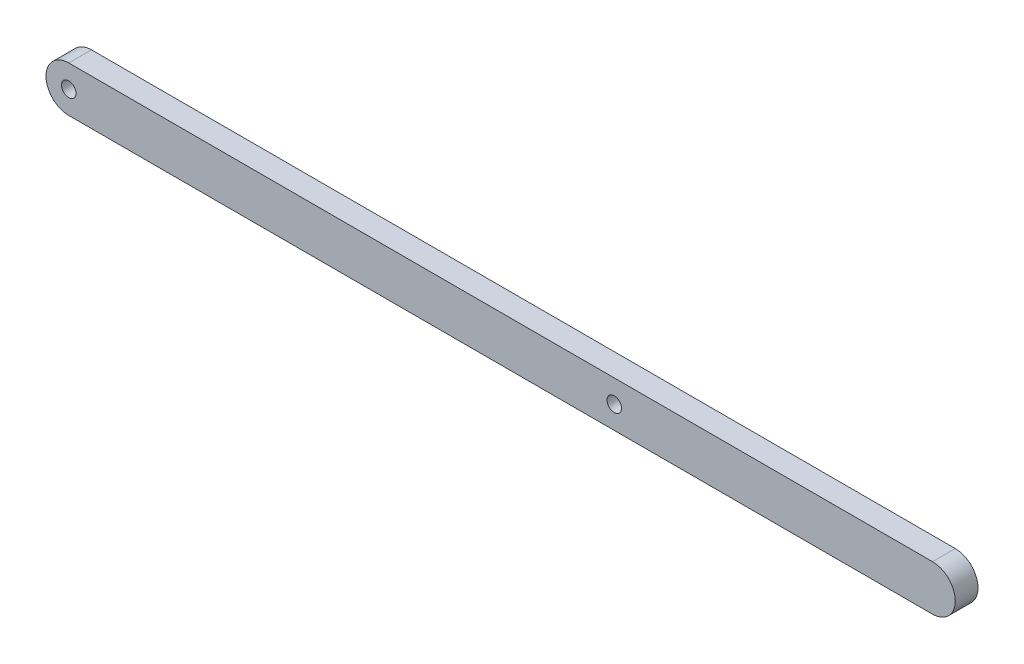
ISO-10303-21;
HEADER;
FILE_DESCRIPTION(('STEP AP214'),'2;1');
FILE_NAME('part.step','',(''),(''),'','','');
FILE_SCHEMA(('AUTOMOTIVE_DESIGN { 1 0 10303 214 1 1 1 1 }'));
ENDSEC;
DATA;
#1=APPLICATION_CONTEXT('core data for automotive mechanical design processes');
#2=APPLICATION_PROTOCOL_DEFINITION('international standard','automotive_design',2000,#1);
#3=PRODUCT_CONTEXT('',#1,'mechanical');
#4=PRODUCT('Part','Part','',(#3));
#5=PRODUCT_RELATED_PRODUCT_CATEGORY('part','',(#4));
#6=PRODUCT_DEFINITION_FORMATION('','',#4);
#7=PRODUCT_DEFINITION_CONTEXT('part definition',#1,'design');
#8=PRODUCT_DEFINITION('design','',#6,#7);
#9=PRODUCT_DEFINITION_SHAPE('','',#8);
#10=(LENGTH_UNIT() NAMED_UNIT(*) SI_UNIT(.MILLI.,.METRE.));
#11=(NAMED_UNIT(*) PLANE_ANGLE_UNIT() SI_UNIT($,.RADIAN.));
#12=(NAMED_UNIT(*) SI_UNIT($,.STERADIAN.) SOLID_ANGLE_UNIT());
#13=UNCERTAINTY_MEASURE_WITH_UNIT(LENGTH_MEASURE(1.E-05),#10,'distance_accuracy_value','');
#14=(GEOMETRIC_REPRESENTATION_CONTEXT(3) GLOBAL_UNCERTAINTY_ASSIGNED_CONTEXT((#13)) GLOBAL_UNIT_ASSIGNED_CONTEXT((#10,
#11,#12)) REPRESENTATION_CONTEXT('',''));
#15=CARTESIAN_POINT('',(0.,0.,0.));
#16=DIRECTION('',(0.,0.,1.));
#17=DIRECTION('',(1.,0.,0.));
#18=AXIS2_PLACEMENT_3D('',#15,#16,#17);
#19=CARTESIAN_POINT('',(0.,0.,5.));
#20=DIRECTION('',(0.,0.,1.));
#21=DIRECTION('',(1.,0.,0.));
#22=AXIS2_PLACEMENT_3D('',#19,#20,#21);
#23=PLANE('',#22);
#24=CARTESIAN_POINT('',(120.,0.,5.));
#25=DIRECTION('',(0.,0.,1.));
#26=DIRECTION('',(1.,0.,0.));
#27=AXIS2_PLACEMENT_3D('',#24,#25,#26);
#28=CIRCLE('',#27,1.60000000000001);
#29=CARTESIAN_POINT('',(121.6,0.,5.));
#30=VERTEX_POINT('',#29);
#31=EDGE_CURVE('E112',#30,#30,#28,.T.);
#32=ORIENTED_EDGE('',*,*,#31,.F.);
#33=EDGE_LOOP('',(#32));
#34=FACE_BOUND('',#33,.T.);
#35=CARTESIAN_POINT('',(0.,0.,5.));
#36=DIRECTION('',(0.,0.,1.));
#37=DIRECTION('',(1.,0.,0.));
#38=AXIS2_PLACEMENT_3D('',#35,#36,#37);
#39=CIRCLE('',#38,5.);
#40=CARTESIAN_POINT('',(0.,5.,5.));
#41=VERTEX_POINT('',#40);
#42=CARTESIAN_POINT('',(0.,-5.,5.));
#43=VERTEX_POINT('',#42);
#44=EDGE_CURVE('E92',#41,#43,#39,.T.);
#45=ORIENTED_EDGE('',*,*,#44,.T.);
#46=DIRECTION('',(1.,0.,0.));
#47=VECTOR('',#46,1.);
#48=CARTESIAN_POINT('',(0.,-5.,5.));
#49=LINE('',#48,#47);
#50=CARTESIAN_POINT('',(190.,-5.,5.));
#51=VERTEX_POINT('',#50);
#52=EDGE_CURVE('E87',#43,#51,#49,.T.);
#53=ORIENTED_EDGE('',*,*,#52,.T.);
#54=CARTESIAN_POINT('',(190.,0.,5.));
#55=DIRECTION('',(0.,0.,1.));
#56=DIRECTION('',(1.,0.,0.));
#57=AXIS2_PLACEMENT_3D('',#54,#55,#56);
#58=CIRCLE('',#57,5.);
#59=CARTESIAN_POINT('',(190.,5.,5.));
#60=VERTEX_POINT('',#59);
#61=EDGE_CURVE('E90',#51,#60,#58,.T.);
#62=ORIENTED_EDGE('',*,*,#61,.T.);
#63=DIRECTION('',(-1.,0.,0.));
#64=VECTOR('',#63,1.);
#65=CARTESIAN_POINT('',(0.,5.,5.));
#66=LINE('',#65,#64);
#67=EDGE_CURVE('E57',#60,#41,#66,.T.);
#68=ORIENTED_EDGE('',*,*,#67,.T.);
#69=EDGE_LOOP('',(#45,#53,#62,#68));
#70=FACE_BOUND('',#69,.T.);
#71=CARTESIAN_POINT('',(0.,0.,5.));
#72=DIRECTION('',(0.,0.,1.));
#73=DIRECTION('',(1.,0.,0.));
#74=AXIS2_PLACEMENT_3D('',#71,#72,#73);
#75=CIRCLE('',#74,1.6);
#76=CARTESIAN_POINT('',(1.6,0.,5.));
#77=VERTEX_POINT('',#76);
#78=EDGE_CURVE('E134',#77,#77,#75,.T.);
#79=ORIENTED_EDGE('',*,*,#78,.F.);
#80=EDGE_LOOP('',(#79));
#81=FACE_BOUND('',#80,.T.);
#82=ADVANCED_FACE('F39',(#34,#70,#81),#23,.T.);
#83=CARTESIAN_POINT('',(0.,0.,0.));
#84=DIRECTION('',(0.,0.,1.));
#85=DIRECTION('',(1.,0.,0.));
#86=AXIS2_PLACEMENT_3D('',#83,#84,#85);
#87=PLANE('',#86);
#88=CARTESIAN_POINT('',(0.,0.,0.));
#89=DIRECTION('',(0.,0.,1.));
#90=DIRECTION('',(1.,0.,0.));
#91=AXIS2_PLACEMENT_3D('',#88,#89,#90);
#92=CIRCLE('',#91,5.);
#93=CARTESIAN_POINT('',(0.,5.,0.));
#94=VERTEX_POINT('',#93);
#95=CARTESIAN_POINT('',(0.,-5.,0.));
#96=VERTEX_POINT('',#95);
#97=EDGE_CURVE('E108',#94,#96,#92,.T.);
#98=ORIENTED_EDGE('',*,*,#97,.F.);
#99=DIRECTION('',(-1.,0.,0.));
#100=VECTOR('',#99,1.);
#101=CARTESIAN_POINT('',(0.,5.,0.));
#102=LINE('',#101,#100);
#103=CARTESIAN_POINT('',(190.,5.,0.));
#104=VERTEX_POINT('',#103);
#105=EDGE_CURVE('E80',#104,#94,#102,.T.);
#106=ORIENTED_EDGE('',*,*,#105,.F.);
#107=CARTESIAN_POINT('',(190.,0.,0.));
#108=DIRECTION('',(0.,0.,1.));
#109=DIRECTION('',(1.,0.,0.));
#110=AXIS2_PLACEMENT_3D('',#107,#108,#109);
#111=CIRCLE('',#110,5.);
#112=CARTESIAN_POINT('',(190.,-5.,0.));
#113=VERTEX_POINT('',#112);
#114=EDGE_CURVE('E74',#113,#104,#111,.T.);
#115=ORIENTED_EDGE('',*,*,#114,.F.);
#116=DIRECTION('',(1.,0.,0.));
#117=VECTOR('',#116,1.);
#118=CARTESIAN_POINT('',(0.,-5.,0.));
#119=LINE('',#118,#117);
#120=EDGE_CURVE('E97',#96,#113,#119,.T.);
#121=ORIENTED_EDGE('',*,*,#120,.F.);
#122=EDGE_LOOP('',(#98,#106,#115,#121));
#123=FACE_BOUND('',#122,.T.);
#124=CARTESIAN_POINT('',(120.,0.,0.));
#125=DIRECTION('',(0.,0.,1.));
#126=DIRECTION('',(1.,0.,0.));
#127=AXIS2_PLACEMENT_3D('',#124,#125,#126);
#128=CIRCLE('',#127,1.60000000000001);
#129=CARTESIAN_POINT('',(121.6,0.,0.));
#130=VERTEX_POINT('',#129);
#131=EDGE_CURVE('E130',#130,#130,#128,.T.);
#132=ORIENTED_EDGE('',*,*,#131,.T.);
#133=EDGE_LOOP('',(#132));
#134=FACE_BOUND('',#133,.T.);
#135=CARTESIAN_POINT('',(0.,0.,0.));
#136=DIRECTION('',(0.,0.,1.));
#137=DIRECTION('',(1.,0.,0.));
#138=AXIS2_PLACEMENT_3D('',#135,#136,#137);
#139=CIRCLE('',#138,1.6);
#140=CARTESIAN_POINT('',(1.6,0.,0.));
#141=VERTEX_POINT('',#140);
#142=EDGE_CURVE('E138',#141,#141,#139,.T.);
#143=ORIENTED_EDGE('',*,*,#142,.T.);
#144=EDGE_LOOP('',(#143));
#145=FACE_BOUND('',#144,.T.);
#146=ADVANCED_FACE('F125',(#123,#134,#145),#87,.F.);
#147=CARTESIAN_POINT('',(0.,0.,5.));
#148=DIRECTION('',(0.,0.,-1.));
#149=DIRECTION('',(-1.,0.,0.));
#150=AXIS2_PLACEMENT_3D('',#147,#148,#149);
#151=CYLINDRICAL_SURFACE('',#150,5.);
#152=ORIENTED_EDGE('',*,*,#97,.T.);
#153=DIRECTION('',(0.,0.,-1.));
#154=VECTOR('',#153,1.);
#155=CARTESIAN_POINT('',(0.,-5.,5.));
#156=LINE('',#155,#154);
#157=EDGE_CURVE('E11',#43,#96,#156,.T.);
#158=ORIENTED_EDGE('',*,*,#157,.F.);
#159=ORIENTED_EDGE('',*,*,#44,.F.);
#160=DIRECTION('',(0.,0.,-1.));
#161=VECTOR('',#160,1.);
#162=CARTESIAN_POINT('',(0.,5.,5.));
#163=LINE('',#162,#161);
#164=EDGE_CURVE('E104',#41,#94,#163,.T.);
#165=ORIENTED_EDGE('',*,*,#164,.T.);
#166=EDGE_LOOP('',(#152,#158,#159,#165));
#167=FACE_BOUND('',#166,.T.);
#168=ADVANCED_FACE('F41',(#167),#151,.T.);
#169=CARTESIAN_POINT('',(0.,-5.,5.));
#170=DIRECTION('',(0.,1.,0.));
#171=DIRECTION('',(0.,0.,1.));
#172=AXIS2_PLACEMENT_3D('',#169,#170,#171);
#173=PLANE('',#172);
#174=ORIENTED_EDGE('',*,*,#120,.T.);
#175=DIRECTION('',(0.,0.,-1.));
#176=VECTOR('',#175,1.);
#177=CARTESIAN_POINT('',(190.,-5.,5.));
#178=LINE('',#177,#176);
#179=EDGE_CURVE('E49',#51,#113,#178,.T.);
#180=ORIENTED_EDGE('',*,*,#179,.F.);
#181=ORIENTED_EDGE('',*,*,#52,.F.);
#182=ORIENTED_EDGE('',*,*,#157,.T.);
#183=EDGE_LOOP('',(#174,#180,#181,#182));
#184=FACE_BOUND('',#183,.T.);
#185=ADVANCED_FACE('F96',(#184),#173,.F.);
#186=CARTESIAN_POINT('',(190.,0.,5.));
#187=DIRECTION('',(0.,0.,-1.));
#188=DIRECTION('',(-1.,0.,0.));
#189=AXIS2_PLACEMENT_3D('',#186,#187,#188);
#190=CYLINDRICAL_SURFACE('',#189,5.);
#191=ORIENTED_EDGE('',*,*,#114,.T.);
#192=DIRECTION('',(0.,0.,-1.));
#193=VECTOR('',#192,1.);
#194=CARTESIAN_POINT('',(190.,5.,5.));
#195=LINE('',#194,#193);
#196=EDGE_CURVE('E99',#60,#104,#195,.T.);
#197=ORIENTED_EDGE('',*,*,#196,.F.);
#198=ORIENTED_EDGE('',*,*,#61,.F.);
#199=ORIENTED_EDGE('',*,*,#179,.T.);
#200=EDGE_LOOP('',(#191,#197,#198,#199));
#201=FACE_BOUND('',#200,.T.);
#202=ADVANCED_FACE('F100',(#201),#190,.T.);
#203=CARTESIAN_POINT('',(0.,5.,5.));
#204=DIRECTION('',(0.,-1.,0.));
#205=DIRECTION('',(0.,0.,-1.));
#206=AXIS2_PLACEMENT_3D('',#203,#204,#205);
#207=PLANE('',#206);
#208=ORIENTED_EDGE('',*,*,#105,.T.);
#209=ORIENTED_EDGE('',*,*,#164,.F.);
#210=ORIENTED_EDGE('',*,*,#67,.F.);
#211=ORIENTED_EDGE('',*,*,#196,.T.);
#212=EDGE_LOOP('',(#208,#209,#210,#211));
#213=FACE_BOUND('',#212,.T.);
#214=ADVANCED_FACE('F122',(#213),#207,.F.);
#215=CARTESIAN_POINT('',(120.,0.,5.));
#216=DIRECTION('',(0.,0.,-1.));
#217=DIRECTION('',(-1.,0.,0.));
#218=AXIS2_PLACEMENT_3D('',#215,#216,#217);
#219=CYLINDRICAL_SURFACE('',#218,1.60000000000001);
#220=ORIENTED_EDGE('',*,*,#31,.T.);
#221=EDGE_LOOP('',(#220));
#222=FACE_BOUND('',#221,.T.);
#223=ORIENTED_EDGE('',*,*,#131,.F.);
#224=EDGE_LOOP('',(#223));
#225=FACE_BOUND('',#224,.T.);
#226=ADVANCED_FACE('F157',(#222,#225),#219,.F.);
#227=CARTESIAN_POINT('',(0.,0.,5.));
#228=DIRECTION('',(0.,0.,-1.));
#229=DIRECTION('',(-1.,0.,0.));
#230=AXIS2_PLACEMENT_3D('',#227,#228,#229);
#231=CYLINDRICAL_SURFACE('',#230,1.6);
#232=ORIENTED_EDGE('',*,*,#78,.T.);
#233=EDGE_LOOP('',(#232));
#234=FACE_BOUND('',#233,.T.);
#235=ORIENTED_EDGE('',*,*,#142,.F.);
#236=EDGE_LOOP('',(#235));
#237=FACE_BOUND('',#236,.T.);
#238=ADVANCED_FACE('F146',(#234,#237),#231,.F.);
#239=CLOSED_SHELL('',(#82,#146,#168,#185,#202,#214,#226,#238));
#240=MANIFOLD_SOLID_BREP('B2',#239);
#241=ADVANCED_BREP_SHAPE_REPRESENTATION('',(#18,#240),#14);
#242=SHAPE_DEFINITION_REPRESENTATION(#9,#241);
ENDSEC;
END-ISO-10303-21;
